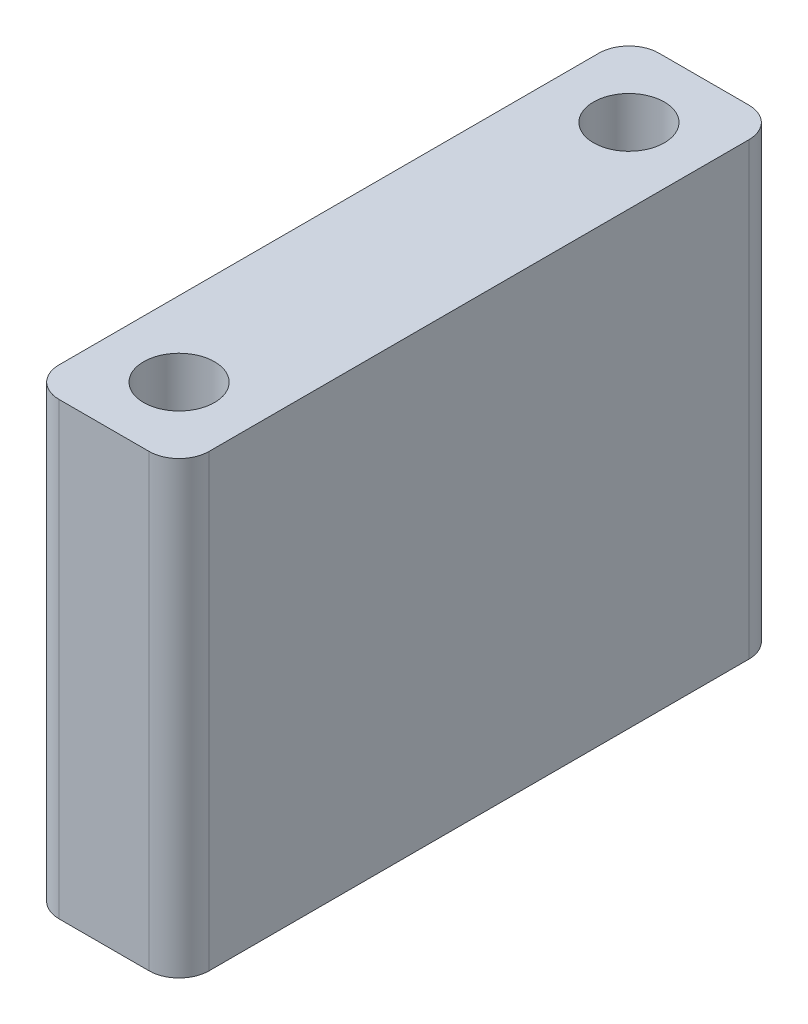
ISO-10303-21;
HEADER;
FILE_DESCRIPTION(('STEP AP214'),'2;1');
FILE_NAME('part.step','',(''),(''),'','','');
FILE_SCHEMA(('AUTOMOTIVE_DESIGN { 1 0 10303 214 1 1 1 1 }'));
ENDSEC;
DATA;
#1=APPLICATION_CONTEXT('core data for automotive mechanical design processes');
#2=APPLICATION_PROTOCOL_DEFINITION('international standard','automotive_design',2000,#1);
#3=PRODUCT_CONTEXT('',#1,'mechanical');
#4=PRODUCT('Part','Part','',(#3));
#5=PRODUCT_RELATED_PRODUCT_CATEGORY('part','',(#4));
#6=PRODUCT_DEFINITION_FORMATION('','',#4);
#7=PRODUCT_DEFINITION_CONTEXT('part definition',#1,'design');
#8=PRODUCT_DEFINITION('design','',#6,#7);
#9=PRODUCT_DEFINITION_SHAPE('','',#8);
#10=(LENGTH_UNIT() NAMED_UNIT(*) SI_UNIT(.MILLI.,.METRE.));
#11=(NAMED_UNIT(*) PLANE_ANGLE_UNIT() SI_UNIT($,.RADIAN.));
#12=(NAMED_UNIT(*) SI_UNIT($,.STERADIAN.) SOLID_ANGLE_UNIT());
#13=UNCERTAINTY_MEASURE_WITH_UNIT(LENGTH_MEASURE(1.E-05),#10,'distance_accuracy_value','');
#14=(GEOMETRIC_REPRESENTATION_CONTEXT(3) GLOBAL_UNCERTAINTY_ASSIGNED_CONTEXT((#13)) GLOBAL_UNIT_ASSIGNED_CONTEXT((#10,
#11,#12)) REPRESENTATION_CONTEXT('',''));
#15=CARTESIAN_POINT('',(0.,0.,0.));
#16=DIRECTION('',(0.,0.,1.));
#17=DIRECTION('',(1.,0.,0.));
#18=AXIS2_PLACEMENT_3D('',#15,#16,#17);
#19=CARTESIAN_POINT('',(-12.7,38.1,0.));
#20=DIRECTION('',(-1.,0.,0.));
#21=DIRECTION('',(0.,0.,1.));
#22=AXIS2_PLACEMENT_3D('',#19,#20,#21);
#23=PLANE('',#22);
#24=DIRECTION('',(0.,0.,-1.));
#25=VECTOR('',#24,1.);
#26=CARTESIAN_POINT('',(-12.7,0.,0.));
#27=LINE('',#26,#25);
#28=CARTESIAN_POINT('',(-12.7,0.,22.86));
#29=VERTEX_POINT('',#28);
#30=CARTESIAN_POINT('',(-12.7,0.,-22.86));
#31=VERTEX_POINT('',#30);
#32=EDGE_CURVE('E139',#29,#31,#27,.T.);
#33=ORIENTED_EDGE('',*,*,#32,.T.);
#34=DIRECTION('',(0.,-1.,0.));
#35=VECTOR('',#34,1.);
#36=CARTESIAN_POINT('',(-12.7,38.1,-22.86));
#37=LINE('',#36,#35);
#38=CARTESIAN_POINT('',(-12.7,38.1,-22.86));
#39=VERTEX_POINT('',#38);
#40=EDGE_CURVE('E11',#39,#31,#37,.T.);
#41=ORIENTED_EDGE('',*,*,#40,.F.);
#42=DIRECTION('',(0.,0.,-1.));
#43=VECTOR('',#42,1.);
#44=CARTESIAN_POINT('',(-12.7,38.1,0.));
#45=LINE('',#44,#43);
#46=CARTESIAN_POINT('',(-12.7,38.1,22.86));
#47=VERTEX_POINT('',#46);
#48=EDGE_CURVE('E157',#47,#39,#45,.T.);
#49=ORIENTED_EDGE('',*,*,#48,.F.);
#50=DIRECTION('',(0.,-1.,0.));
#51=VECTOR('',#50,1.);
#52=CARTESIAN_POINT('',(-12.7,38.1,22.86));
#53=LINE('',#52,#51);
#54=EDGE_CURVE('E138',#47,#29,#53,.T.);
#55=ORIENTED_EDGE('',*,*,#54,.T.);
#56=EDGE_LOOP('',(#33,#41,#49,#55));
#57=FACE_BOUND('',#56,.T.);
#58=ADVANCED_FACE('F39',(#57),#23,.F.);
#59=CARTESIAN_POINT('',(-15.24,38.1,-22.86));
#60=DIRECTION('',(0.,-1.,0.));
#61=DIRECTION('',(0.,0.,-1.));
#62=AXIS2_PLACEMENT_3D('',#59,#60,#61);
#63=CYLINDRICAL_SURFACE('',#62,2.54);
#64=CARTESIAN_POINT('',(-15.24,0.,-22.86));
#65=DIRECTION('',(0.,1.,0.));
#66=DIRECTION('',(0.,0.,1.));
#67=AXIS2_PLACEMENT_3D('',#64,#65,#66);
#68=CIRCLE('',#67,2.54);
#69=CARTESIAN_POINT('',(-15.24,0.,-25.4));
#70=VERTEX_POINT('',#69);
#71=EDGE_CURVE('E142',#31,#70,#68,.T.);
#72=ORIENTED_EDGE('',*,*,#71,.T.);
#73=DIRECTION('',(0.,-1.,0.));
#74=VECTOR('',#73,1.);
#75=CARTESIAN_POINT('',(-15.24,38.1,-25.4));
#76=LINE('',#75,#74);
#77=CARTESIAN_POINT('',(-15.24,38.1,-25.4));
#78=VERTEX_POINT('',#77);
#79=EDGE_CURVE('E48',#78,#70,#76,.T.);
#80=ORIENTED_EDGE('',*,*,#79,.F.);
#81=CARTESIAN_POINT('',(-15.24,38.1,-22.86));
#82=DIRECTION('',(0.,1.,0.));
#83=DIRECTION('',(0.,0.,1.));
#84=AXIS2_PLACEMENT_3D('',#81,#82,#83);
#85=CIRCLE('',#84,2.54);
#86=EDGE_CURVE('E99',#39,#78,#85,.T.);
#87=ORIENTED_EDGE('',*,*,#86,.F.);
#88=ORIENTED_EDGE('',*,*,#40,.T.);
#89=EDGE_LOOP('',(#72,#80,#87,#88));
#90=FACE_BOUND('',#89,.T.);
#91=ADVANCED_FACE('F210',(#90),#63,.T.);
#92=CARTESIAN_POINT('',(0.,38.1,-25.4));
#93=DIRECTION('',(0.,0.,-1.));
#94=DIRECTION('',(-1.,0.,0.));
#95=AXIS2_PLACEMENT_3D('',#92,#93,#94);
#96=PLANE('',#95);
#97=DIRECTION('',(1.,0.,0.));
#98=VECTOR('',#97,1.);
#99=CARTESIAN_POINT('',(0.,0.,-25.4));
#100=LINE('',#99,#98);
#101=CARTESIAN_POINT('',(-22.86,0.,-25.4));
#102=VERTEX_POINT('',#101);
#103=EDGE_CURVE('E145',#102,#70,#100,.T.);
#104=ORIENTED_EDGE('',*,*,#103,.F.);
#105=DIRECTION('',(0.,-1.,0.));
#106=VECTOR('',#105,1.);
#107=CARTESIAN_POINT('',(-22.86,38.1,-25.4));
#108=LINE('',#107,#106);
#109=CARTESIAN_POINT('',(-22.86,38.1,-25.4));
#110=VERTEX_POINT('',#109);
#111=EDGE_CURVE('E163',#110,#102,#108,.T.);
#112=ORIENTED_EDGE('',*,*,#111,.F.);
#113=DIRECTION('',(1.,0.,0.));
#114=VECTOR('',#113,1.);
#115=CARTESIAN_POINT('',(0.,38.1,-25.4));
#116=LINE('',#115,#114);
#117=EDGE_CURVE('E181',#110,#78,#116,.T.);
#118=ORIENTED_EDGE('',*,*,#117,.T.);
#119=ORIENTED_EDGE('',*,*,#79,.T.);
#120=EDGE_LOOP('',(#104,#112,#118,#119));
#121=FACE_BOUND('',#120,.T.);
#122=ADVANCED_FACE('F214',(#121),#96,.T.);
#123=CARTESIAN_POINT('',(-22.86,38.1,-22.86));
#124=DIRECTION('',(0.,-1.,0.));
#125=DIRECTION('',(0.,0.,-1.));
#126=AXIS2_PLACEMENT_3D('',#123,#124,#125);
#127=CYLINDRICAL_SURFACE('',#126,2.54);
#128=CARTESIAN_POINT('',(-22.86,0.,-22.86));
#129=DIRECTION('',(0.,1.,0.));
#130=DIRECTION('',(0.,0.,1.));
#131=AXIS2_PLACEMENT_3D('',#128,#129,#130);
#132=CIRCLE('',#131,2.54);
#133=CARTESIAN_POINT('',(-25.4,0.,-22.86));
#134=VERTEX_POINT('',#133);
#135=EDGE_CURVE('E148',#134,#102,#132,.F.);
#136=ORIENTED_EDGE('',*,*,#135,.F.);
#137=DIRECTION('',(0.,-1.,0.));
#138=VECTOR('',#137,1.);
#139=CARTESIAN_POINT('',(-25.4,38.1,-22.86));
#140=LINE('',#139,#138);
#141=CARTESIAN_POINT('',(-25.4,38.1,-22.86));
#142=VERTEX_POINT('',#141);
#143=EDGE_CURVE('E161',#142,#134,#140,.T.);
#144=ORIENTED_EDGE('',*,*,#143,.F.);
#145=CARTESIAN_POINT('',(-22.86,38.1,-22.86));
#146=DIRECTION('',(0.,1.,0.));
#147=DIRECTION('',(0.,0.,1.));
#148=AXIS2_PLACEMENT_3D('',#145,#146,#147);
#149=CIRCLE('',#148,2.54);
#150=EDGE_CURVE('E133',#142,#110,#149,.F.);
#151=ORIENTED_EDGE('',*,*,#150,.T.);
#152=ORIENTED_EDGE('',*,*,#111,.T.);
#153=EDGE_LOOP('',(#136,#144,#151,#152));
#154=FACE_BOUND('',#153,.T.);
#155=ADVANCED_FACE('F186',(#154),#127,.T.);
#156=CARTESIAN_POINT('',(-25.4,38.1,0.));
#157=DIRECTION('',(-1.,0.,0.));
#158=DIRECTION('',(0.,0.,1.));
#159=AXIS2_PLACEMENT_3D('',#156,#157,#158);
#160=PLANE('',#159);
#161=DIRECTION('',(0.,0.,-1.));
#162=VECTOR('',#161,1.);
#163=CARTESIAN_POINT('',(-25.4,0.,0.));
#164=LINE('',#163,#162);
#165=CARTESIAN_POINT('',(-25.4,0.,22.86));
#166=VERTEX_POINT('',#165);
#167=EDGE_CURVE('E151',#166,#134,#164,.T.);
#168=ORIENTED_EDGE('',*,*,#167,.F.);
#169=DIRECTION('',(0.,-1.,0.));
#170=VECTOR('',#169,1.);
#171=CARTESIAN_POINT('',(-25.4,38.1,22.86));
#172=LINE('',#171,#170);
#173=CARTESIAN_POINT('',(-25.4,38.1,22.86));
#174=VERTEX_POINT('',#173);
#175=EDGE_CURVE('E121',#174,#166,#172,.T.);
#176=ORIENTED_EDGE('',*,*,#175,.F.);
#177=DIRECTION('',(0.,0.,-1.));
#178=VECTOR('',#177,1.);
#179=CARTESIAN_POINT('',(-25.4,38.1,0.));
#180=LINE('',#179,#178);
#181=EDGE_CURVE('E131',#174,#142,#180,.T.);
#182=ORIENTED_EDGE('',*,*,#181,.T.);
#183=ORIENTED_EDGE('',*,*,#143,.T.);
#184=EDGE_LOOP('',(#168,#176,#182,#183));
#185=FACE_BOUND('',#184,.T.);
#186=ADVANCED_FACE('F191',(#185),#160,.T.);
#187=CARTESIAN_POINT('',(-22.86,38.1,22.86));
#188=DIRECTION('',(0.,-1.,0.));
#189=DIRECTION('',(0.,0.,-1.));
#190=AXIS2_PLACEMENT_3D('',#187,#188,#189);
#191=CYLINDRICAL_SURFACE('',#190,2.54);
#192=CARTESIAN_POINT('',(-22.86,0.,22.86));
#193=DIRECTION('',(0.,1.,0.));
#194=DIRECTION('',(0.,0.,1.));
#195=AXIS2_PLACEMENT_3D('',#192,#193,#194);
#196=CIRCLE('',#195,2.54);
#197=CARTESIAN_POINT('',(-22.86,0.,25.4));
#198=VERTEX_POINT('',#197);
#199=EDGE_CURVE('E120',#198,#166,#196,.F.);
#200=ORIENTED_EDGE('',*,*,#199,.F.);
#201=DIRECTION('',(0.,-1.,0.));
#202=VECTOR('',#201,1.);
#203=CARTESIAN_POINT('',(-22.86,38.1,25.4));
#204=LINE('',#203,#202);
#205=CARTESIAN_POINT('',(-22.86,38.1,25.4));
#206=VERTEX_POINT('',#205);
#207=EDGE_CURVE('E114',#206,#198,#204,.T.);
#208=ORIENTED_EDGE('',*,*,#207,.F.);
#209=CARTESIAN_POINT('',(-22.86,38.1,22.86));
#210=DIRECTION('',(0.,1.,0.));
#211=DIRECTION('',(0.,0.,1.));
#212=AXIS2_PLACEMENT_3D('',#209,#210,#211);
#213=CIRCLE('',#212,2.54);
#214=EDGE_CURVE('E118',#206,#174,#213,.F.);
#215=ORIENTED_EDGE('',*,*,#214,.T.);
#216=ORIENTED_EDGE('',*,*,#175,.T.);
#217=EDGE_LOOP('',(#200,#208,#215,#216));
#218=FACE_BOUND('',#217,.T.);
#219=ADVANCED_FACE('F116',(#218),#191,.T.);
#220=CARTESIAN_POINT('',(0.,38.1,25.4));
#221=DIRECTION('',(0.,0.,-1.));
#222=DIRECTION('',(-1.,0.,0.));
#223=AXIS2_PLACEMENT_3D('',#220,#221,#222);
#224=PLANE('',#223);
#225=DIRECTION('',(1.,0.,0.));
#226=VECTOR('',#225,1.);
#227=CARTESIAN_POINT('',(0.,0.,25.4));
#228=LINE('',#227,#226);
#229=CARTESIAN_POINT('',(-15.24,0.,25.4));
#230=VERTEX_POINT('',#229);
#231=EDGE_CURVE('E85',#198,#230,#228,.T.);
#232=ORIENTED_EDGE('',*,*,#231,.T.);
#233=DIRECTION('',(0.,-1.,0.));
#234=VECTOR('',#233,1.);
#235=CARTESIAN_POINT('',(-15.24,38.1,25.4));
#236=LINE('',#235,#234);
#237=CARTESIAN_POINT('',(-15.24,38.1,25.4));
#238=VERTEX_POINT('',#237);
#239=EDGE_CURVE('E122',#238,#230,#236,.T.);
#240=ORIENTED_EDGE('',*,*,#239,.F.);
#241=DIRECTION('',(1.,0.,0.));
#242=VECTOR('',#241,1.);
#243=CARTESIAN_POINT('',(0.,38.1,25.4));
#244=LINE('',#243,#242);
#245=EDGE_CURVE('E124',#206,#238,#244,.T.);
#246=ORIENTED_EDGE('',*,*,#245,.F.);
#247=ORIENTED_EDGE('',*,*,#207,.T.);
#248=EDGE_LOOP('',(#232,#240,#246,#247));
#249=FACE_BOUND('',#248,.T.);
#250=ADVANCED_FACE('F125',(#249),#224,.F.);
#251=CARTESIAN_POINT('',(-15.24,38.1,22.86));
#252=DIRECTION('',(0.,-1.,0.));
#253=DIRECTION('',(0.,0.,-1.));
#254=AXIS2_PLACEMENT_3D('',#251,#252,#253);
#255=CYLINDRICAL_SURFACE('',#254,2.54);
#256=CARTESIAN_POINT('',(-15.24,0.,22.86));
#257=DIRECTION('',(0.,1.,0.));
#258=DIRECTION('',(0.,0.,1.));
#259=AXIS2_PLACEMENT_3D('',#256,#257,#258);
#260=CIRCLE('',#259,2.54);
#261=EDGE_CURVE('E91',#230,#29,#260,.T.);
#262=ORIENTED_EDGE('',*,*,#261,.T.);
#263=ORIENTED_EDGE('',*,*,#54,.F.);
#264=CARTESIAN_POINT('',(-15.24,38.1,22.86));
#265=DIRECTION('',(0.,1.,0.));
#266=DIRECTION('',(0.,0.,1.));
#267=AXIS2_PLACEMENT_3D('',#264,#265,#266);
#268=CIRCLE('',#267,2.54);
#269=EDGE_CURVE('E57',#238,#47,#268,.T.);
#270=ORIENTED_EDGE('',*,*,#269,.F.);
#271=ORIENTED_EDGE('',*,*,#239,.T.);
#272=EDGE_LOOP('',(#262,#263,#270,#271));
#273=FACE_BOUND('',#272,.T.);
#274=ADVANCED_FACE('F198',(#273),#255,.T.);
#275=CARTESIAN_POINT('',(0.,38.1,0.));
#276=DIRECTION('',(0.,1.,0.));
#277=DIRECTION('',(0.,0.,1.));
#278=AXIS2_PLACEMENT_3D('',#275,#276,#277);
#279=PLANE('',#278);
#280=CARTESIAN_POINT('',(-19.05,38.1,-19.05));
#281=DIRECTION('',(0.,1.,0.));
#282=DIRECTION('',(0.,0.,1.));
#283=AXIS2_PLACEMENT_3D('',#280,#281,#282);
#284=CIRCLE('',#283,3.);
#285=CARTESIAN_POINT('',(-19.05,38.1,-16.05));
#286=VERTEX_POINT('',#285);
#287=EDGE_CURVE('E167',#286,#286,#284,.T.);
#288=ORIENTED_EDGE('',*,*,#287,.F.);
#289=EDGE_LOOP('',(#288));
#290=FACE_BOUND('',#289,.T.);
#291=CARTESIAN_POINT('',(-19.05,38.1,19.05));
#292=DIRECTION('',(0.,1.,0.));
#293=DIRECTION('',(0.,0.,1.));
#294=AXIS2_PLACEMENT_3D('',#291,#292,#293);
#295=CIRCLE('',#294,3.);
#296=CARTESIAN_POINT('',(-19.05,38.1,22.05));
#297=VERTEX_POINT('',#296);
#298=EDGE_CURVE('E172',#297,#297,#295,.T.);
#299=ORIENTED_EDGE('',*,*,#298,.F.);
#300=EDGE_LOOP('',(#299));
#301=FACE_BOUND('',#300,.T.);
#302=ORIENTED_EDGE('',*,*,#48,.T.);
#303=ORIENTED_EDGE('',*,*,#86,.T.);
#304=ORIENTED_EDGE('',*,*,#117,.F.);
#305=ORIENTED_EDGE('',*,*,#150,.F.);
#306=ORIENTED_EDGE('',*,*,#181,.F.);
#307=ORIENTED_EDGE('',*,*,#214,.F.);
#308=ORIENTED_EDGE('',*,*,#245,.T.);
#309=ORIENTED_EDGE('',*,*,#269,.T.);
#310=EDGE_LOOP('',(#302,#303,#304,#305,#306,#307,#308,#309));
#311=FACE_BOUND('',#310,.T.);
#312=ADVANCED_FACE('F128',(#290,#301,#311),#279,.T.);
#313=CARTESIAN_POINT('',(0.,0.,0.));
#314=DIRECTION('',(0.,1.,0.));
#315=DIRECTION('',(0.,0.,1.));
#316=AXIS2_PLACEMENT_3D('',#313,#314,#315);
#317=PLANE('',#316);
#318=CARTESIAN_POINT('',(-19.05,0.,-19.05));
#319=DIRECTION('',(0.,1.,0.));
#320=DIRECTION('',(0.,0.,1.));
#321=AXIS2_PLACEMENT_3D('',#318,#319,#320);
#322=CIRCLE('',#321,3.);
#323=CARTESIAN_POINT('',(-19.05,0.,-16.05));
#324=VERTEX_POINT('',#323);
#325=EDGE_CURVE('E42',#324,#324,#322,.T.);
#326=ORIENTED_EDGE('',*,*,#325,.T.);
#327=EDGE_LOOP('',(#326));
#328=FACE_BOUND('',#327,.T.);
#329=CARTESIAN_POINT('',(-19.05,0.,19.05));
#330=DIRECTION('',(0.,1.,0.));
#331=DIRECTION('',(0.,0.,1.));
#332=AXIS2_PLACEMENT_3D('',#329,#330,#331);
#333=CIRCLE('',#332,3.);
#334=CARTESIAN_POINT('',(-19.05,0.,22.05));
#335=VERTEX_POINT('',#334);
#336=EDGE_CURVE('E165',#335,#335,#333,.T.);
#337=ORIENTED_EDGE('',*,*,#336,.T.);
#338=EDGE_LOOP('',(#337));
#339=FACE_BOUND('',#338,.T.);
#340=ORIENTED_EDGE('',*,*,#32,.F.);
#341=ORIENTED_EDGE('',*,*,#261,.F.);
#342=ORIENTED_EDGE('',*,*,#231,.F.);
#343=ORIENTED_EDGE('',*,*,#199,.T.);
#344=ORIENTED_EDGE('',*,*,#167,.T.);
#345=ORIENTED_EDGE('',*,*,#135,.T.);
#346=ORIENTED_EDGE('',*,*,#103,.T.);
#347=ORIENTED_EDGE('',*,*,#71,.F.);
#348=EDGE_LOOP('',(#340,#341,#342,#343,#344,#345,#346,#347));
#349=FACE_BOUND('',#348,.T.);
#350=ADVANCED_FACE('F194',(#328,#339,#349),#317,.F.);
#351=CARTESIAN_POINT('',(-19.05,-11.9,19.05));
#352=DIRECTION('',(0.,1.,0.));
#353=DIRECTION('',(0.,0.,1.));
#354=AXIS2_PLACEMENT_3D('',#351,#352,#353);
#355=CYLINDRICAL_SURFACE('',#354,3.);
#356=CARTESIAN_POINT('',(-19.05,38.1,22.05));
#357=CARTESIAN_POINT('',(-19.05,37.703125,22.05));
#358=CARTESIAN_POINT('',(-19.05,37.30625,22.05));
#359=CARTESIAN_POINT('',(-19.05,36.5125,22.05));
#360=CARTESIAN_POINT('',(-19.05,36.115625,22.05));
#361=CARTESIAN_POINT('',(-19.05,35.321875,22.05));
#362=CARTESIAN_POINT('',(-19.05,34.925,22.05));
#363=CARTESIAN_POINT('',(-19.05,34.13125,22.05));
#364=CARTESIAN_POINT('',(-19.05,33.734375,22.05));
#365=CARTESIAN_POINT('',(-19.05,32.940625,22.05));
#366=CARTESIAN_POINT('',(-19.05,32.54375,22.05));
#367=CARTESIAN_POINT('',(-19.05,31.75,22.05));
#368=CARTESIAN_POINT('',(-19.05,31.353125,22.05));
#369=CARTESIAN_POINT('',(-19.05,30.559375,22.05));
#370=CARTESIAN_POINT('',(-19.05,30.1625,22.05));
#371=CARTESIAN_POINT('',(-19.05,29.36875,22.05));
#372=CARTESIAN_POINT('',(-19.05,28.971875,22.05));
#373=CARTESIAN_POINT('',(-19.05,28.178125,22.05));
#374=CARTESIAN_POINT('',(-19.05,27.78125,22.05));
#375=CARTESIAN_POINT('',(-19.05,26.9875,22.05));
#376=CARTESIAN_POINT('',(-19.05,26.590625,22.05));
#377=CARTESIAN_POINT('',(-19.05,25.796875,22.05));
#378=CARTESIAN_POINT('',(-19.05,25.4,22.05));
#379=CARTESIAN_POINT('',(-19.05,24.60625,22.05));
#380=CARTESIAN_POINT('',(-19.05,24.209375,22.05));
#381=CARTESIAN_POINT('',(-19.05,23.415625,22.05));
#382=CARTESIAN_POINT('',(-19.05,23.01875,22.05));
#383=CARTESIAN_POINT('',(-19.05,22.225,22.05));
#384=CARTESIAN_POINT('',(-19.05,21.828125,22.05));
#385=CARTESIAN_POINT('',(-19.05,21.034375,22.05));
#386=CARTESIAN_POINT('',(-19.05,20.6375,22.05));
#387=CARTESIAN_POINT('',(-19.05,19.84375,22.05));
#388=CARTESIAN_POINT('',(-19.05,19.446875,22.05));
#389=CARTESIAN_POINT('',(-19.05,18.653125,22.05));
#390=CARTESIAN_POINT('',(-19.05,18.25625,22.05));
#391=CARTESIAN_POINT('',(-19.05,17.4625,22.05));
#392=CARTESIAN_POINT('',(-19.05,17.065625,22.05));
#393=CARTESIAN_POINT('',(-19.05,16.271875,22.05));
#394=CARTESIAN_POINT('',(-19.05,15.875,22.05));
#395=CARTESIAN_POINT('',(-19.05,15.08125,22.05));
#396=CARTESIAN_POINT('',(-19.05,14.684375,22.05));
#397=CARTESIAN_POINT('',(-19.05,13.890625,22.05));
#398=CARTESIAN_POINT('',(-19.05,13.49375,22.05));
#399=CARTESIAN_POINT('',(-19.05,12.7,22.05));
#400=CARTESIAN_POINT('',(-19.05,12.303125,22.05));
#401=CARTESIAN_POINT('',(-19.05,11.509375,22.05));
#402=CARTESIAN_POINT('',(-19.05,11.1125,22.05));
#403=CARTESIAN_POINT('',(-19.05,10.31875,22.05));
#404=CARTESIAN_POINT('',(-19.05,9.921875,22.05));
#405=CARTESIAN_POINT('',(-19.05,9.128125,22.05));
#406=CARTESIAN_POINT('',(-19.05,8.73125,22.05));
#407=CARTESIAN_POINT('',(-19.05,7.9375,22.05));
#408=CARTESIAN_POINT('',(-19.05,7.540625,22.05));
#409=CARTESIAN_POINT('',(-19.05,6.746875,22.05));
#410=CARTESIAN_POINT('',(-19.05,6.35,22.05));
#411=CARTESIAN_POINT('',(-19.05,5.55625,22.05));
#412=CARTESIAN_POINT('',(-19.05,5.159375,22.05));
#413=CARTESIAN_POINT('',(-19.05,4.365625,22.05));
#414=CARTESIAN_POINT('',(-19.05,3.96875,22.05));
#415=CARTESIAN_POINT('',(-19.05,3.175,22.05));
#416=CARTESIAN_POINT('',(-19.05,2.778125,22.05));
#417=CARTESIAN_POINT('',(-19.05,1.984375,22.05));
#418=CARTESIAN_POINT('',(-19.05,1.5875,22.05));
#419=CARTESIAN_POINT('',(-19.05,0.793749999999999,22.05));
#420=CARTESIAN_POINT('',(-19.05,0.396874999999999,22.05));
#421=CARTESIAN_POINT('',(-19.05,0.,22.05));
#422=B_SPLINE_CURVE_WITH_KNOTS('',3,(#356,#357,#358,#359,#360,#361,#362,#363,#364,#365,#366,
#367,#368,#369,#370,#371,#372,#373,#374,#375,#376,#377,#378,#379,#380,#381,#382,#383,#384,#385,
#386,#387,#388,#389,#390,#391,#392,#393,#394,#395,#396,#397,#398,#399,#400,#401,#402,#403,#404,
#405,#406,#407,#408,#409,#410,#411,#412,#413,#414,#415,#416,#417,#418,#419,#420,#421),
.UNSPECIFIED.,.F.,.F.,(4,2,2,2,2,2,2,2,2,2,2,2,2,2,2,2,2,2,2,2,2,2,2,2,2,2,2,2,2,2,2,2,4),(0.,
1.190625,2.38125,3.571875,4.7625,5.953125,7.14375,8.334375,9.52500000000001,10.715625,11.90625,
13.096875,14.2875,15.478125,16.66875,17.859375,19.05,20.240625,21.43125,22.621875,23.8125,
25.003125,26.19375,27.384375,28.575,29.765625,30.95625,32.146875,33.3375,34.528125,35.71875,
36.909375,38.1),.UNSPECIFIED.);
#423=EDGE_CURVE('BSEAM256',#297,#335,#422,.T.);
#424=ORIENTED_EDGE('',*,*,#298,.T.);
#425=ORIENTED_EDGE('',*,*,#336,.F.);
#426=ORIENTED_EDGE('',*,*,#423,.T.);
#427=ORIENTED_EDGE('',*,*,#423,.F.);
#428=EDGE_LOOP('',(#424,#426,#425,#427));
#429=FACE_BOUND('',#428,.T.);
#430=ADVANCED_FACE('F256',(#429),#355,.F.);
#431=CARTESIAN_POINT('',(-19.05,-11.9,-19.05));
#432=DIRECTION('',(0.,1.,0.));
#433=DIRECTION('',(0.,0.,1.));
#434=AXIS2_PLACEMENT_3D('',#431,#432,#433);
#435=CYLINDRICAL_SURFACE('',#434,3.);
#436=CARTESIAN_POINT('',(-19.05,38.1,-16.05));
#437=CARTESIAN_POINT('',(-19.05,37.703125,-16.05));
#438=CARTESIAN_POINT('',(-19.05,37.30625,-16.05));
#439=CARTESIAN_POINT('',(-19.05,36.5125,-16.05));
#440=CARTESIAN_POINT('',(-19.05,36.115625,-16.05));
#441=CARTESIAN_POINT('',(-19.05,35.321875,-16.05));
#442=CARTESIAN_POINT('',(-19.05,34.925,-16.05));
#443=CARTESIAN_POINT('',(-19.05,34.13125,-16.05));
#444=CARTESIAN_POINT('',(-19.05,33.734375,-16.05));
#445=CARTESIAN_POINT('',(-19.05,32.940625,-16.05));
#446=CARTESIAN_POINT('',(-19.05,32.54375,-16.05));
#447=CARTESIAN_POINT('',(-19.05,31.75,-16.05));
#448=CARTESIAN_POINT('',(-19.05,31.353125,-16.05));
#449=CARTESIAN_POINT('',(-19.05,30.559375,-16.05));
#450=CARTESIAN_POINT('',(-19.05,30.1625,-16.05));
#451=CARTESIAN_POINT('',(-19.05,29.36875,-16.05));
#452=CARTESIAN_POINT('',(-19.05,28.971875,-16.05));
#453=CARTESIAN_POINT('',(-19.05,28.178125,-16.05));
#454=CARTESIAN_POINT('',(-19.05,27.78125,-16.05));
#455=CARTESIAN_POINT('',(-19.05,26.9875,-16.05));
#456=CARTESIAN_POINT('',(-19.05,26.590625,-16.05));
#457=CARTESIAN_POINT('',(-19.05,25.796875,-16.05));
#458=CARTESIAN_POINT('',(-19.05,25.4,-16.05));
#459=CARTESIAN_POINT('',(-19.05,24.60625,-16.05));
#460=CARTESIAN_POINT('',(-19.05,24.209375,-16.05));
#461=CARTESIAN_POINT('',(-19.05,23.415625,-16.05));
#462=CARTESIAN_POINT('',(-19.05,23.01875,-16.05));
#463=CARTESIAN_POINT('',(-19.05,22.225,-16.05));
#464=CARTESIAN_POINT('',(-19.05,21.828125,-16.05));
#465=CARTESIAN_POINT('',(-19.05,21.034375,-16.05));
#466=CARTESIAN_POINT('',(-19.05,20.6375,-16.05));
#467=CARTESIAN_POINT('',(-19.05,19.84375,-16.05));
#468=CARTESIAN_POINT('',(-19.05,19.446875,-16.05));
#469=CARTESIAN_POINT('',(-19.05,18.653125,-16.05));
#470=CARTESIAN_POINT('',(-19.05,18.25625,-16.05));
#471=CARTESIAN_POINT('',(-19.05,17.4625,-16.05));
#472=CARTESIAN_POINT('',(-19.05,17.065625,-16.05));
#473=CARTESIAN_POINT('',(-19.05,16.271875,-16.05));
#474=CARTESIAN_POINT('',(-19.05,15.875,-16.05));
#475=CARTESIAN_POINT('',(-19.05,15.08125,-16.05));
#476=CARTESIAN_POINT('',(-19.05,14.684375,-16.05));
#477=CARTESIAN_POINT('',(-19.05,13.890625,-16.05));
#478=CARTESIAN_POINT('',(-19.05,13.49375,-16.05));
#479=CARTESIAN_POINT('',(-19.05,12.7,-16.05));
#480=CARTESIAN_POINT('',(-19.05,12.303125,-16.05));
#481=CARTESIAN_POINT('',(-19.05,11.509375,-16.05));
#482=CARTESIAN_POINT('',(-19.05,11.1125,-16.05));
#483=CARTESIAN_POINT('',(-19.05,10.31875,-16.05));
#484=CARTESIAN_POINT('',(-19.05,9.921875,-16.05));
#485=CARTESIAN_POINT('',(-19.05,9.128125,-16.05));
#486=CARTESIAN_POINT('',(-19.05,8.73125,-16.05));
#487=CARTESIAN_POINT('',(-19.05,7.9375,-16.05));
#488=CARTESIAN_POINT('',(-19.05,7.540625,-16.05));
#489=CARTESIAN_POINT('',(-19.05,6.746875,-16.05));
#490=CARTESIAN_POINT('',(-19.05,6.35,-16.05));
#491=CARTESIAN_POINT('',(-19.05,5.55625,-16.05));
#492=CARTESIAN_POINT('',(-19.05,5.159375,-16.05));
#493=CARTESIAN_POINT('',(-19.05,4.365625,-16.05));
#494=CARTESIAN_POINT('',(-19.05,3.96875,-16.05));
#495=CARTESIAN_POINT('',(-19.05,3.175,-16.05));
#496=CARTESIAN_POINT('',(-19.05,2.778125,-16.05));
#497=CARTESIAN_POINT('',(-19.05,1.984375,-16.05));
#498=CARTESIAN_POINT('',(-19.05,1.5875,-16.05));
#499=CARTESIAN_POINT('',(-19.05,0.793749999999999,-16.05));
#500=CARTESIAN_POINT('',(-19.05,0.396874999999999,-16.05));
#501=CARTESIAN_POINT('',(-19.05,0.,-16.05));
#502=B_SPLINE_CURVE_WITH_KNOTS('',3,(#436,#437,#438,#439,#440,#441,#442,#443,#444,#445,#446,
#447,#448,#449,#450,#451,#452,#453,#454,#455,#456,#457,#458,#459,#460,#461,#462,#463,#464,#465,
#466,#467,#468,#469,#470,#471,#472,#473,#474,#475,#476,#477,#478,#479,#480,#481,#482,#483,#484,
#485,#486,#487,#488,#489,#490,#491,#492,#493,#494,#495,#496,#497,#498,#499,#500,#501),
.UNSPECIFIED.,.F.,.F.,(4,2,2,2,2,2,2,2,2,2,2,2,2,2,2,2,2,2,2,2,2,2,2,2,2,2,2,2,2,2,2,2,4),(0.,
1.190625,2.38125,3.571875,4.7625,5.953125,7.14375,8.334375,9.52500000000001,10.715625,11.90625,
13.096875,14.2875,15.478125,16.66875,17.859375,19.05,20.240625,21.43125,22.621875,23.8125,
25.003125,26.19375,27.384375,28.575,29.765625,30.95625,32.146875,33.3375,34.528125,35.71875,
36.909375,38.1),.UNSPECIFIED.);
#503=EDGE_CURVE('BSEAM266',#286,#324,#502,.T.);
#504=ORIENTED_EDGE('',*,*,#287,.T.);
#505=ORIENTED_EDGE('',*,*,#325,.F.);
#506=ORIENTED_EDGE('',*,*,#503,.T.);
#507=ORIENTED_EDGE('',*,*,#503,.F.);
#508=EDGE_LOOP('',(#504,#506,#505,#507));
#509=FACE_BOUND('',#508,.T.);
#510=ADVANCED_FACE('F266',(#509),#435,.F.);
#511=CLOSED_SHELL('',(#58,#91,#122,#155,#186,#219,#250,#274,#312,#350,#430,#510));
#512=MANIFOLD_SOLID_BREP('B2',#511);
#513=ADVANCED_BREP_SHAPE_REPRESENTATION('',(#18,#512),#14);
#514=SHAPE_DEFINITION_REPRESENTATION(#9,#513);
ENDSEC;
END-ISO-10303-21;
